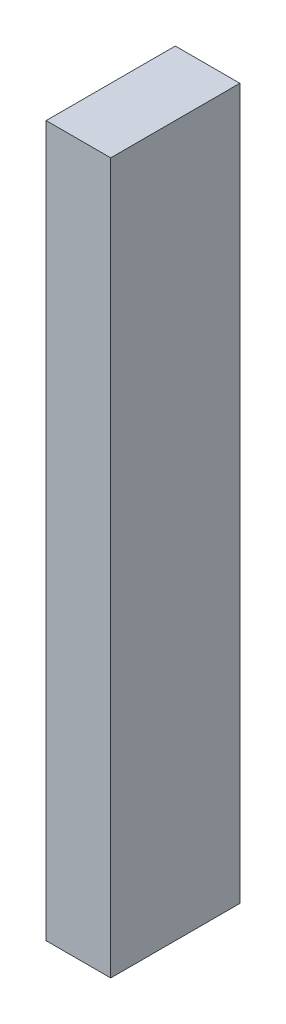
ISO-10303-21;
HEADER;
FILE_DESCRIPTION(('STEP AP214'),'2;1');
FILE_NAME('part.step','',(''),(''),'','','');
FILE_SCHEMA(('AUTOMOTIVE_DESIGN { 1 0 10303 214 1 1 1 1 }'));
ENDSEC;
DATA;
#1=APPLICATION_CONTEXT('core data for automotive mechanical design processes');
#2=APPLICATION_PROTOCOL_DEFINITION('international standard','automotive_design',2000,#1);
#3=PRODUCT_CONTEXT('',#1,'mechanical');
#4=PRODUCT('Part','Part','',(#3));
#5=PRODUCT_RELATED_PRODUCT_CATEGORY('part','',(#4));
#6=PRODUCT_DEFINITION_FORMATION('','',#4);
#7=PRODUCT_DEFINITION_CONTEXT('part definition',#1,'design');
#8=PRODUCT_DEFINITION('design','',#6,#7);
#9=PRODUCT_DEFINITION_SHAPE('','',#8);
#10=(LENGTH_UNIT() NAMED_UNIT(*) SI_UNIT(.MILLI.,.METRE.));
#11=(NAMED_UNIT(*) PLANE_ANGLE_UNIT() SI_UNIT($,.RADIAN.));
#12=(NAMED_UNIT(*) SI_UNIT($,.STERADIAN.) SOLID_ANGLE_UNIT());
#13=UNCERTAINTY_MEASURE_WITH_UNIT(LENGTH_MEASURE(1.E-05),#10,'distance_accuracy_value','');
#14=(GEOMETRIC_REPRESENTATION_CONTEXT(3) GLOBAL_UNCERTAINTY_ASSIGNED_CONTEXT((#13)) GLOBAL_UNIT_ASSIGNED_CONTEXT((#10,
#11,#12)) REPRESENTATION_CONTEXT('',''));
#15=CARTESIAN_POINT('',(0.,0.,0.));
#16=DIRECTION('',(0.,0.,1.));
#17=DIRECTION('',(1.,0.,0.));
#18=AXIS2_PLACEMENT_3D('',#15,#16,#17);
#19=CARTESIAN_POINT('',(0.,558.8,0.));
#20=DIRECTION('',(1.,0.,0.));
#21=DIRECTION('',(0.,0.,-1.));
#22=AXIS2_PLACEMENT_3D('',#19,#20,#21);
#23=PLANE('',#22);
#24=DIRECTION('',(0.,0.,1.));
#25=VECTOR('',#24,1.);
#26=CARTESIAN_POINT('',(0.,0.,0.));
#27=LINE('',#26,#25);
#28=CARTESIAN_POINT('',(0.,0.,-101.6));
#29=VERTEX_POINT('',#28);
#30=CARTESIAN_POINT('',(0.,0.,0.));
#31=VERTEX_POINT('',#30);
#32=EDGE_CURVE('E107',#29,#31,#27,.T.);
#33=ORIENTED_EDGE('',*,*,#32,.T.);
#34=DIRECTION('',(0.,-1.,0.));
#35=VECTOR('',#34,1.);
#36=CARTESIAN_POINT('',(0.,558.8,0.));
#37=LINE('',#36,#35);
#38=CARTESIAN_POINT('',(0.,558.8,0.));
#39=VERTEX_POINT('',#38);
#40=EDGE_CURVE('E11',#39,#31,#37,.T.);
#41=ORIENTED_EDGE('',*,*,#40,.F.);
#42=DIRECTION('',(0.,0.,1.));
#43=VECTOR('',#42,1.);
#44=CARTESIAN_POINT('',(0.,558.8,0.));
#45=LINE('',#44,#43);
#46=CARTESIAN_POINT('',(0.,558.8,-101.6));
#47=VERTEX_POINT('',#46);
#48=EDGE_CURVE('E91',#47,#39,#45,.T.);
#49=ORIENTED_EDGE('',*,*,#48,.F.);
#50=DIRECTION('',(0.,-1.,0.));
#51=VECTOR('',#50,1.);
#52=CARTESIAN_POINT('',(0.,558.8,-101.6));
#53=LINE('',#52,#51);
#54=EDGE_CURVE('E103',#47,#29,#53,.T.);
#55=ORIENTED_EDGE('',*,*,#54,.T.);
#56=EDGE_LOOP('',(#33,#41,#49,#55));
#57=FACE_BOUND('',#56,.T.);
#58=ADVANCED_FACE('F39',(#57),#23,.F.);
#59=CARTESIAN_POINT('',(0.,558.8,0.));
#60=DIRECTION('',(0.,0.,-1.));
#61=DIRECTION('',(-1.,0.,0.));
#62=AXIS2_PLACEMENT_3D('',#59,#60,#61);
#63=PLANE('',#62);
#64=DIRECTION('',(1.,0.,0.));
#65=VECTOR('',#64,1.);
#66=CARTESIAN_POINT('',(0.,0.,0.));
#67=LINE('',#66,#65);
#68=CARTESIAN_POINT('',(50.8,0.,0.));
#69=VERTEX_POINT('',#68);
#70=EDGE_CURVE('E96',#31,#69,#67,.T.);
#71=ORIENTED_EDGE('',*,*,#70,.T.);
#72=DIRECTION('',(0.,-1.,0.));
#73=VECTOR('',#72,1.);
#74=CARTESIAN_POINT('',(50.8,558.8,0.));
#75=LINE('',#74,#73);
#76=CARTESIAN_POINT('',(50.8,558.8,0.));
#77=VERTEX_POINT('',#76);
#78=EDGE_CURVE('E48',#77,#69,#75,.T.);
#79=ORIENTED_EDGE('',*,*,#78,.F.);
#80=DIRECTION('',(1.,0.,0.));
#81=VECTOR('',#80,1.);
#82=CARTESIAN_POINT('',(0.,558.8,0.));
#83=LINE('',#82,#81);
#84=EDGE_CURVE('E86',#39,#77,#83,.T.);
#85=ORIENTED_EDGE('',*,*,#84,.F.);
#86=ORIENTED_EDGE('',*,*,#40,.T.);
#87=EDGE_LOOP('',(#71,#79,#85,#86));
#88=FACE_BOUND('',#87,.T.);
#89=ADVANCED_FACE('F95',(#88),#63,.F.);
#90=CARTESIAN_POINT('',(50.8,558.8,0.));
#91=DIRECTION('',(-1.,0.,0.));
#92=DIRECTION('',(0.,0.,1.));
#93=AXIS2_PLACEMENT_3D('',#90,#91,#92);
#94=PLANE('',#93);
#95=DIRECTION('',(0.,0.,-1.));
#96=VECTOR('',#95,1.);
#97=CARTESIAN_POINT('',(50.8,0.,0.));
#98=LINE('',#97,#96);
#99=CARTESIAN_POINT('',(50.8,0.,-101.6));
#100=VERTEX_POINT('',#99);
#101=EDGE_CURVE('E73',#69,#100,#98,.T.);
#102=ORIENTED_EDGE('',*,*,#101,.T.);
#103=DIRECTION('',(0.,-1.,0.));
#104=VECTOR('',#103,1.);
#105=CARTESIAN_POINT('',(50.8,558.8,-101.6));
#106=LINE('',#105,#104);
#107=CARTESIAN_POINT('',(50.8,558.8,-101.6));
#108=VERTEX_POINT('',#107);
#109=EDGE_CURVE('E98',#108,#100,#106,.T.);
#110=ORIENTED_EDGE('',*,*,#109,.F.);
#111=DIRECTION('',(0.,0.,-1.));
#112=VECTOR('',#111,1.);
#113=CARTESIAN_POINT('',(50.8,558.8,0.));
#114=LINE('',#113,#112);
#115=EDGE_CURVE('E89',#77,#108,#114,.T.);
#116=ORIENTED_EDGE('',*,*,#115,.F.);
#117=ORIENTED_EDGE('',*,*,#78,.T.);
#118=EDGE_LOOP('',(#102,#110,#116,#117));
#119=FACE_BOUND('',#118,.T.);
#120=ADVANCED_FACE('F99',(#119),#94,.F.);
#121=CARTESIAN_POINT('',(0.,558.8,-101.6));
#122=DIRECTION('',(0.,0.,1.));
#123=DIRECTION('',(1.,0.,0.));
#124=AXIS2_PLACEMENT_3D('',#121,#122,#123);
#125=PLANE('',#124);
#126=DIRECTION('',(-1.,0.,0.));
#127=VECTOR('',#126,1.);
#128=CARTESIAN_POINT('',(0.,0.,-101.6));
#129=LINE('',#128,#127);
#130=EDGE_CURVE('E79',#100,#29,#129,.T.);
#131=ORIENTED_EDGE('',*,*,#130,.T.);
#132=ORIENTED_EDGE('',*,*,#54,.F.);
#133=DIRECTION('',(-1.,0.,0.));
#134=VECTOR('',#133,1.);
#135=CARTESIAN_POINT('',(0.,558.8,-101.6));
#136=LINE('',#135,#134);
#137=EDGE_CURVE('E56',#108,#47,#136,.T.);
#138=ORIENTED_EDGE('',*,*,#137,.F.);
#139=ORIENTED_EDGE('',*,*,#109,.T.);
#140=EDGE_LOOP('',(#131,#132,#138,#139));
#141=FACE_BOUND('',#140,.T.);
#142=ADVANCED_FACE('F120',(#141),#125,.F.);
#143=CARTESIAN_POINT('',(0.,558.8,0.));
#144=DIRECTION('',(0.,-1.,0.));
#145=DIRECTION('',(0.,0.,-1.));
#146=AXIS2_PLACEMENT_3D('',#143,#144,#145);
#147=PLANE('',#146);
#148=ORIENTED_EDGE('',*,*,#48,.T.);
#149=ORIENTED_EDGE('',*,*,#84,.T.);
#150=ORIENTED_EDGE('',*,*,#115,.T.);
#151=ORIENTED_EDGE('',*,*,#137,.T.);
#152=EDGE_LOOP('',(#148,#149,#150,#151));
#153=FACE_BOUND('',#152,.T.);
#154=ADVANCED_FACE('F87',(#153),#147,.F.);
#155=CARTESIAN_POINT('',(0.,0.,0.));
#156=DIRECTION('',(0.,-1.,0.));
#157=DIRECTION('',(0.,0.,-1.));
#158=AXIS2_PLACEMENT_3D('',#155,#156,#157);
#159=PLANE('',#158);
#160=ORIENTED_EDGE('',*,*,#32,.F.);
#161=ORIENTED_EDGE('',*,*,#130,.F.);
#162=ORIENTED_EDGE('',*,*,#101,.F.);
#163=ORIENTED_EDGE('',*,*,#70,.F.);
#164=EDGE_LOOP('',(#160,#161,#162,#163));
#165=FACE_BOUND('',#164,.T.);
#166=ADVANCED_FACE('F123',(#165),#159,.T.);
#167=CLOSED_SHELL('',(#58,#89,#120,#142,#154,#166));
#168=MANIFOLD_SOLID_BREP('B2',#167);
#169=ADVANCED_BREP_SHAPE_REPRESENTATION('',(#18,#168),#14);
#170=SHAPE_DEFINITION_REPRESENTATION(#9,#169);
ENDSEC;
END-ISO-10303-21;
